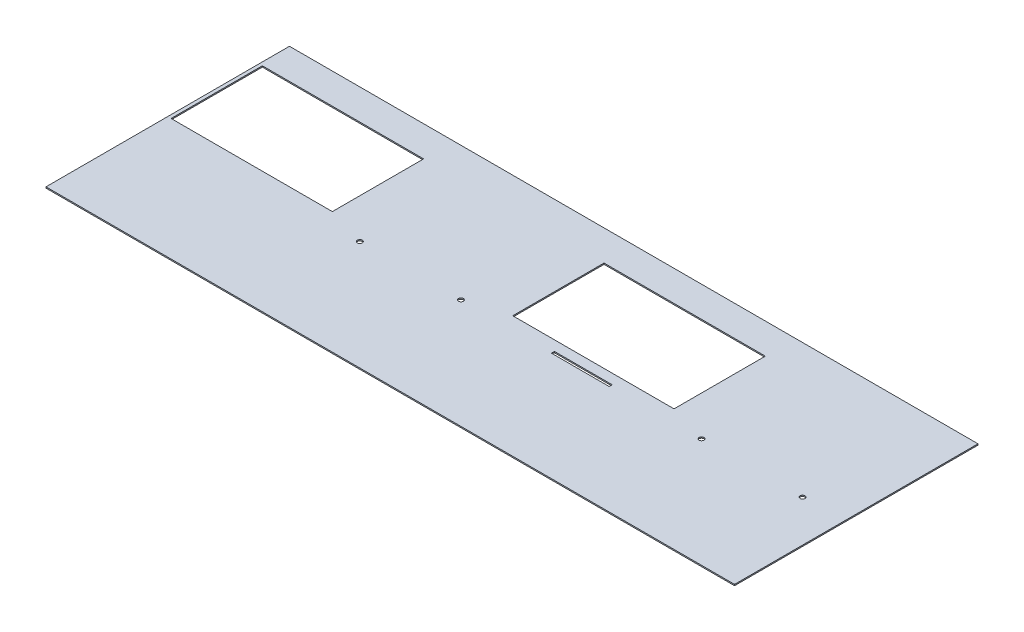
ISO-10303-21;
HEADER;
FILE_DESCRIPTION(('STEP AP214'),'2;1');
FILE_NAME('part.step','',(''),(''),'','','');
FILE_SCHEMA(('AUTOMOTIVE_DESIGN { 1 0 10303 214 1 1 1 1 }'));
ENDSEC;
DATA;
#1=APPLICATION_CONTEXT('core data for automotive mechanical design processes');
#2=APPLICATION_PROTOCOL_DEFINITION('international standard','automotive_design',2000,#1);
#3=PRODUCT_CONTEXT('',#1,'mechanical');
#4=PRODUCT('Part','Part','',(#3));
#5=PRODUCT_RELATED_PRODUCT_CATEGORY('part','',(#4));
#6=PRODUCT_DEFINITION_FORMATION('','',#4);
#7=PRODUCT_DEFINITION_CONTEXT('part definition',#1,'design');
#8=PRODUCT_DEFINITION('design','',#6,#7);
#9=PRODUCT_DEFINITION_SHAPE('','',#8);
#10=(LENGTH_UNIT() NAMED_UNIT(*) SI_UNIT(.MILLI.,.METRE.));
#11=(NAMED_UNIT(*) PLANE_ANGLE_UNIT() SI_UNIT($,.RADIAN.));
#12=(NAMED_UNIT(*) SI_UNIT($,.STERADIAN.) SOLID_ANGLE_UNIT());
#13=UNCERTAINTY_MEASURE_WITH_UNIT(LENGTH_MEASURE(1.E-05),#10,'distance_accuracy_value','');
#14=(GEOMETRIC_REPRESENTATION_CONTEXT(3) GLOBAL_UNCERTAINTY_ASSIGNED_CONTEXT((#13)) GLOBAL_UNIT_ASSIGNED_CONTEXT((#10,
#11,#12)) REPRESENTATION_CONTEXT('',''));
#15=CARTESIAN_POINT('',(0.,0.,0.));
#16=DIRECTION('',(0.,0.,1.));
#17=DIRECTION('',(1.,0.,0.));
#18=AXIS2_PLACEMENT_3D('',#15,#16,#17);
#19=CARTESIAN_POINT('',(142.,2.,200.));
#20=DIRECTION('',(0.,0.,-1.));
#21=DIRECTION('',(-1.,0.,0.));
#22=AXIS2_PLACEMENT_3D('',#19,#20,#21);
#23=PLANE('',#22);
#24=DIRECTION('',(1.,0.,0.));
#25=VECTOR('',#24,1.);
#26=CARTESIAN_POINT('',(142.,0.,200.));
#27=LINE('',#26,#25);
#28=CARTESIAN_POINT('',(-699.424777960769,-5.80091530366644E-12,200.));
#29=VERTEX_POINT('',#28);
#30=CARTESIAN_POINT('',(431.924777960769,-2.19269047363468E-12,200.));
#31=VERTEX_POINT('',#30);
#32=EDGE_CURVE('E258',#29,#31,#27,.T.);
#33=ORIENTED_EDGE('',*,*,#32,.T.);
#34=DIRECTION('',(0.,1.,0.));
#35=VECTOR('',#34,1.);
#36=CARTESIAN_POINT('',(431.924777960769,-2.13717932240343E-12,200.));
#37=LINE('',#36,#35);
#38=CARTESIAN_POINT('',(431.924777960769,1.99999999999781,200.));
#39=VERTEX_POINT('',#38);
#40=EDGE_CURVE('E344',#31,#39,#37,.T.);
#41=ORIENTED_EDGE('',*,*,#40,.T.);
#42=DIRECTION('',(1.,0.,0.));
#43=VECTOR('',#42,1.);
#44=CARTESIAN_POINT('',(142.,2.,200.));
#45=LINE('',#44,#43);
#46=CARTESIAN_POINT('',(-699.424777960769,1.9999999999942,200.));
#47=VERTEX_POINT('',#46);
#48=EDGE_CURVE('E141',#47,#39,#45,.T.);
#49=ORIENTED_EDGE('',*,*,#48,.F.);
#50=DIRECTION('',(0.,1.,0.));
#51=VECTOR('',#50,1.);
#52=CARTESIAN_POINT('',(-699.424777960769,-5.80091530366644E-12,200.));
#53=LINE('',#52,#51);
#54=EDGE_CURVE('E322',#29,#47,#53,.T.);
#55=ORIENTED_EDGE('',*,*,#54,.F.);
#56=EDGE_LOOP('',(#33,#41,#49,#55));
#57=FACE_BOUND('',#56,.T.);
#58=ADVANCED_FACE('F131',(#57),#23,.F.);
#59=CARTESIAN_POINT('',(142.,2.,-200.));
#60=DIRECTION('',(0.,0.,1.));
#61=DIRECTION('',(1.,0.,0.));
#62=AXIS2_PLACEMENT_3D('',#59,#60,#61);
#63=PLANE('',#62);
#64=DIRECTION('',(-1.,0.,0.));
#65=VECTOR('',#64,1.);
#66=CARTESIAN_POINT('',(142.,2.,-200.));
#67=LINE('',#66,#65);
#68=CARTESIAN_POINT('',(431.924777960769,1.99999999999781,-200.));
#69=VERTEX_POINT('',#68);
#70=CARTESIAN_POINT('',(-699.424777960769,1.9999999999942,-200.));
#71=VERTEX_POINT('',#70);
#72=EDGE_CURVE('E13',#69,#71,#67,.T.);
#73=ORIENTED_EDGE('',*,*,#72,.F.);
#74=DIRECTION('',(0.,1.,0.));
#75=VECTOR('',#74,1.);
#76=CARTESIAN_POINT('',(431.924777960769,-2.13717932240343E-12,-200.));
#77=LINE('',#76,#75);
#78=CARTESIAN_POINT('',(431.924777960769,-2.19269047363468E-12,-200.));
#79=VERTEX_POINT('',#78);
#80=EDGE_CURVE('E253',#79,#69,#77,.T.);
#81=ORIENTED_EDGE('',*,*,#80,.F.);
#82=DIRECTION('',(-1.,0.,0.));
#83=VECTOR('',#82,1.);
#84=CARTESIAN_POINT('',(142.,0.,-200.));
#85=LINE('',#84,#83);
#86=CARTESIAN_POINT('',(-699.424777960769,-5.80091530366644E-12,-200.));
#87=VERTEX_POINT('',#86);
#88=EDGE_CURVE('E247',#79,#87,#85,.T.);
#89=ORIENTED_EDGE('',*,*,#88,.T.);
#90=DIRECTION('',(0.,1.,0.));
#91=VECTOR('',#90,1.);
#92=CARTESIAN_POINT('',(-699.424777960769,-5.80091530366644E-12,-200.));
#93=LINE('',#92,#91);
#94=EDGE_CURVE('E251',#87,#71,#93,.T.);
#95=ORIENTED_EDGE('',*,*,#94,.T.);
#96=EDGE_LOOP('',(#73,#81,#89,#95));
#97=FACE_BOUND('',#96,.T.);
#98=ADVANCED_FACE('F249',(#97),#63,.F.);
#99=CARTESIAN_POINT('',(0.,2.,0.));
#100=DIRECTION('',(0.,1.,0.));
#101=DIRECTION('',(0.,0.,1.));
#102=AXIS2_PLACEMENT_3D('',#99,#100,#101);
#103=PLANE('',#102);
#104=DIRECTION('',(1.,0.,0.));
#105=VECTOR('',#104,1.);
#106=CARTESIAN_POINT('',(-47.5,2.,16.4999999999999));
#107=LINE('',#106,#105);
#108=CARTESIAN_POINT('',(-47.5,2.,16.4999999999999));
#109=VERTEX_POINT('',#108);
#110=CARTESIAN_POINT('',(47.5,2.,16.4999999999999));
#111=VERTEX_POINT('',#110);
#112=EDGE_CURVE('E360',#109,#111,#107,.T.);
#113=ORIENTED_EDGE('',*,*,#112,.T.);
#114=DIRECTION('',(0.,0.,1.));
#115=VECTOR('',#114,1.);
#116=CARTESIAN_POINT('',(47.5,2.,21.4999999999999));
#117=LINE('',#116,#115);
#118=CARTESIAN_POINT('',(47.5,2.,21.4999999999999));
#119=VERTEX_POINT('',#118);
#120=EDGE_CURVE('E385',#111,#119,#117,.T.);
#121=ORIENTED_EDGE('',*,*,#120,.T.);
#122=DIRECTION('',(-1.,0.,0.));
#123=VECTOR('',#122,1.);
#124=CARTESIAN_POINT('',(-47.5,2.,21.4999999999999));
#125=LINE('',#124,#123);
#126=CARTESIAN_POINT('',(-47.5,2.,21.4999999999999));
#127=VERTEX_POINT('',#126);
#128=EDGE_CURVE('E380',#119,#127,#125,.T.);
#129=ORIENTED_EDGE('',*,*,#128,.T.);
#130=DIRECTION('',(0.,0.,-1.));
#131=VECTOR('',#130,1.);
#132=CARTESIAN_POINT('',(-47.5,2.,21.4999999999999));
#133=LINE('',#132,#131);
#134=EDGE_CURVE('E375',#127,#109,#133,.T.);
#135=ORIENTED_EDGE('',*,*,#134,.T.);
#136=EDGE_LOOP('',(#113,#121,#129,#135));
#137=FACE_BOUND('',#136,.T.);
#138=DIRECTION('',(0.,0.,1.));
#139=VECTOR('',#138,1.);
#140=CARTESIAN_POINT('',(-132.5,2.,0.));
#141=LINE('',#140,#139);
#142=CARTESIAN_POINT('',(-132.5,2.,-150.));
#143=VERTEX_POINT('',#142);
#144=CARTESIAN_POINT('',(-132.5,2.,0.));
#145=VERTEX_POINT('',#144);
#146=EDGE_CURVE('E423',#143,#145,#141,.T.);
#147=ORIENTED_EDGE('',*,*,#146,.F.);
#148=DIRECTION('',(-1.,0.,0.));
#149=VECTOR('',#148,1.);
#150=CARTESIAN_POINT('',(0.,2.,-150.));
#151=LINE('',#150,#149);
#152=CARTESIAN_POINT('',(132.5,2.,-150.));
#153=VERTEX_POINT('',#152);
#154=EDGE_CURVE('E412',#153,#143,#151,.T.);
#155=ORIENTED_EDGE('',*,*,#154,.F.);
#156=DIRECTION('',(0.,0.,-1.));
#157=VECTOR('',#156,1.);
#158=CARTESIAN_POINT('',(132.5,2.,0.));
#159=LINE('',#158,#157);
#160=CARTESIAN_POINT('',(132.5,2.,0.));
#161=VERTEX_POINT('',#160);
#162=EDGE_CURVE('E415',#161,#153,#159,.T.);
#163=ORIENTED_EDGE('',*,*,#162,.F.);
#164=DIRECTION('',(1.,0.,0.));
#165=VECTOR('',#164,1.);
#166=CARTESIAN_POINT('',(0.,2.,0.));
#167=LINE('',#166,#165);
#168=EDGE_CURVE('E420',#145,#161,#167,.T.);
#169=ORIENTED_EDGE('',*,*,#168,.F.);
#170=EDGE_LOOP('',(#147,#155,#163,#169));
#171=FACE_BOUND('',#170,.T.);
#172=ORIENTED_EDGE('',*,*,#48,.T.);
#173=DIRECTION('',(0.,0.,-1.));
#174=VECTOR('',#173,1.);
#175=CARTESIAN_POINT('',(431.924777960769,1.99999999999781,200.));
#176=LINE('',#175,#174);
#177=EDGE_CURVE('E353',#69,#39,#176,.F.);
#178=ORIENTED_EDGE('',*,*,#177,.F.);
#179=ORIENTED_EDGE('',*,*,#72,.T.);
#180=DIRECTION('',(0.,0.,1.));
#181=VECTOR('',#180,1.);
#182=CARTESIAN_POINT('',(-699.424777960769,1.9999999999942,-200.));
#183=LINE('',#182,#181);
#184=EDGE_CURVE('E272',#47,#71,#183,.F.);
#185=ORIENTED_EDGE('',*,*,#184,.F.);
#186=EDGE_LOOP('',(#172,#178,#179,#185));
#187=FACE_BOUND('',#186,.T.);
#188=CARTESIAN_POINT('',(197.712388980385,1.99999999999964,19.9999999999999));
#189=DIRECTION('',(0.,-1.,0.));
#190=DIRECTION('',(1.,0.,0.));
#191=AXIS2_PLACEMENT_3D('',#188,#189,#190);
#192=CIRCLE('',#191,4.00000000000001);
#193=CARTESIAN_POINT('',(201.712388980385,1.99999999999956,19.9999999999999));
#194=VERTEX_POINT('',#193);
#195=EDGE_CURVE('E332',#194,#194,#192,.T.);
#196=ORIENTED_EDGE('',*,*,#195,.T.);
#197=EDGE_LOOP('',(#196));
#198=FACE_BOUND('',#197,.T.);
#199=CARTESIAN_POINT('',(363.712388980385,1.99999999999848,20.));
#200=DIRECTION('',(0.,-1.,0.));
#201=DIRECTION('',(1.,0.,0.));
#202=AXIS2_PLACEMENT_3D('',#199,#200,#201);
#203=CIRCLE('',#202,4.00000000000001);
#204=CARTESIAN_POINT('',(367.712388980385,1.99999999999845,20.));
#205=VERTEX_POINT('',#204);
#206=EDGE_CURVE('E327',#205,#205,#203,.T.);
#207=ORIENTED_EDGE('',*,*,#206,.T.);
#208=EDGE_LOOP('',(#207));
#209=FACE_BOUND('',#208,.T.);
#210=DIRECTION('',(0.,0.,-1.));
#211=VECTOR('',#210,1.);
#212=CARTESIAN_POINT('',(-428.92477796077,1.99999999999798,0.));
#213=LINE('',#212,#211);
#214=CARTESIAN_POINT('',(-428.92477796077,1.99999999999703,0.));
#215=VERTEX_POINT('',#214);
#216=CARTESIAN_POINT('',(-428.92477796077,1.99999999999798,-150.));
#217=VERTEX_POINT('',#216);
#218=EDGE_CURVE('E288',#215,#217,#213,.T.);
#219=ORIENTED_EDGE('',*,*,#218,.F.);
#220=DIRECTION('',(1.,0.,0.));
#221=VECTOR('',#220,1.);
#222=CARTESIAN_POINT('',(-561.424777960768,1.99999999999614,0.));
#223=LINE('',#222,#221);
#224=CARTESIAN_POINT('',(-693.92477796077,1.99999999999428,0.));
#225=VERTEX_POINT('',#224);
#226=EDGE_CURVE('E299',#225,#215,#223,.T.);
#227=ORIENTED_EDGE('',*,*,#226,.F.);
#228=DIRECTION('',(0.,0.,1.));
#229=VECTOR('',#228,1.);
#230=CARTESIAN_POINT('',(-693.92477796077,1.99999999999428,0.));
#231=LINE('',#230,#229);
#232=CARTESIAN_POINT('',(-693.92477796077,1.99999999999523,-150.));
#233=VERTEX_POINT('',#232);
#234=EDGE_CURVE('E310',#233,#225,#231,.T.);
#235=ORIENTED_EDGE('',*,*,#234,.F.);
#236=DIRECTION('',(-1.,0.,0.));
#237=VECTOR('',#236,1.);
#238=CARTESIAN_POINT('',(-561.424777960768,1.99999999999614,-150.));
#239=LINE('',#238,#237);
#240=EDGE_CURVE('E319',#217,#233,#239,.T.);
#241=ORIENTED_EDGE('',*,*,#240,.F.);
#242=EDGE_LOOP('',(#219,#227,#235,#241));
#243=FACE_BOUND('',#242,.T.);
#244=CARTESIAN_POINT('',(-197.712388980386,1.99999999999964,19.9999999999999));
#245=DIRECTION('',(0.,-1.,0.));
#246=DIRECTION('',(1.,0.,0.));
#247=AXIS2_PLACEMENT_3D('',#244,#245,#246);
#248=CIRCLE('',#247,4.00000000000001);
#249=CARTESIAN_POINT('',(-201.712388980386,1.99999999999961,19.9999999999999));
#250=VERTEX_POINT('',#249);
#251=EDGE_CURVE('E274',#250,#250,#248,.T.);
#252=ORIENTED_EDGE('',*,*,#251,.T.);
#253=EDGE_LOOP('',(#252));
#254=FACE_BOUND('',#253,.T.);
#255=CARTESIAN_POINT('',(-363.712388980386,1.99999999999848,20.));
#256=DIRECTION('',(0.,-1.,0.));
#257=DIRECTION('',(1.,0.,0.));
#258=AXIS2_PLACEMENT_3D('',#255,#256,#257);
#259=CIRCLE('',#258,4.00000000000001);
#260=CARTESIAN_POINT('',(-367.712388980386,1.99999999999845,20.));
#261=VERTEX_POINT('',#260);
#262=EDGE_CURVE('E278',#261,#261,#259,.T.);
#263=ORIENTED_EDGE('',*,*,#262,.T.);
#264=EDGE_LOOP('',(#263));
#265=FACE_BOUND('',#264,.T.);
#266=ADVANCED_FACE('F456',(#137,#171,#187,#198,#209,#243,#254,#265),#103,.T.);
#267=CARTESIAN_POINT('',(0.,0.,0.));
#268=DIRECTION('',(0.,1.,0.));
#269=DIRECTION('',(0.,0.,1.));
#270=AXIS2_PLACEMENT_3D('',#267,#268,#269);
#271=PLANE('',#270);
#272=DIRECTION('',(0.,0.,1.));
#273=VECTOR('',#272,1.);
#274=CARTESIAN_POINT('',(47.5,0.,21.4999999999999));
#275=LINE('',#274,#273);
#276=CARTESIAN_POINT('',(47.5,0.,16.4999999999999));
#277=VERTEX_POINT('',#276);
#278=CARTESIAN_POINT('',(47.5,0.,21.4999999999999));
#279=VERTEX_POINT('',#278);
#280=EDGE_CURVE('E361',#277,#279,#275,.T.);
#281=ORIENTED_EDGE('',*,*,#280,.F.);
#282=DIRECTION('',(1.,0.,0.));
#283=VECTOR('',#282,1.);
#284=CARTESIAN_POINT('',(-47.5,0.,16.4999999999999));
#285=LINE('',#284,#283);
#286=CARTESIAN_POINT('',(-47.5,0.,16.4999999999999));
#287=VERTEX_POINT('',#286);
#288=EDGE_CURVE('E365',#287,#277,#285,.T.);
#289=ORIENTED_EDGE('',*,*,#288,.F.);
#290=DIRECTION('',(0.,0.,-1.));
#291=VECTOR('',#290,1.);
#292=CARTESIAN_POINT('',(-47.5,0.,21.4999999999999));
#293=LINE('',#292,#291);
#294=CARTESIAN_POINT('',(-47.5,0.,21.4999999999999));
#295=VERTEX_POINT('',#294);
#296=EDGE_CURVE('E331',#295,#287,#293,.T.);
#297=ORIENTED_EDGE('',*,*,#296,.F.);
#298=DIRECTION('',(-1.,0.,0.));
#299=VECTOR('',#298,1.);
#300=CARTESIAN_POINT('',(-47.5,0.,21.4999999999999));
#301=LINE('',#300,#299);
#302=EDGE_CURVE('E157',#279,#295,#301,.T.);
#303=ORIENTED_EDGE('',*,*,#302,.F.);
#304=EDGE_LOOP('',(#281,#289,#297,#303));
#305=FACE_BOUND('',#304,.T.);
#306=DIRECTION('',(1.,0.,0.));
#307=VECTOR('',#306,1.);
#308=CARTESIAN_POINT('',(-132.5,0.,-150.));
#309=LINE('',#308,#307);
#310=CARTESIAN_POINT('',(-132.5,0.,-150.));
#311=VERTEX_POINT('',#310);
#312=CARTESIAN_POINT('',(132.5,0.,-150.));
#313=VERTEX_POINT('',#312);
#314=EDGE_CURVE('E400',#311,#313,#309,.T.);
#315=ORIENTED_EDGE('',*,*,#314,.F.);
#316=DIRECTION('',(0.,0.,-1.));
#317=VECTOR('',#316,1.);
#318=CARTESIAN_POINT('',(-132.5,0.,0.));
#319=LINE('',#318,#317);
#320=CARTESIAN_POINT('',(-132.5,0.,0.));
#321=VERTEX_POINT('',#320);
#322=EDGE_CURVE('E397',#321,#311,#319,.T.);
#323=ORIENTED_EDGE('',*,*,#322,.F.);
#324=DIRECTION('',(-1.,0.,0.));
#325=VECTOR('',#324,1.);
#326=CARTESIAN_POINT('',(-132.5,0.,0.));
#327=LINE('',#326,#325);
#328=CARTESIAN_POINT('',(132.5,0.,0.));
#329=VERTEX_POINT('',#328);
#330=EDGE_CURVE('E408',#329,#321,#327,.T.);
#331=ORIENTED_EDGE('',*,*,#330,.F.);
#332=DIRECTION('',(0.,0.,1.));
#333=VECTOR('',#332,1.);
#334=CARTESIAN_POINT('',(132.5,0.,0.));
#335=LINE('',#334,#333);
#336=EDGE_CURVE('E404',#313,#329,#335,.T.);
#337=ORIENTED_EDGE('',*,*,#336,.F.);
#338=EDGE_LOOP('',(#315,#323,#331,#337));
#339=FACE_BOUND('',#338,.T.);
#340=ORIENTED_EDGE('',*,*,#88,.F.);
#341=DIRECTION('',(0.,0.,1.));
#342=VECTOR('',#341,1.);
#343=CARTESIAN_POINT('',(431.924777960769,-2.19269047363468E-12,0.));
#344=LINE('',#343,#342);
#345=EDGE_CURVE('E348',#79,#31,#344,.T.);
#346=ORIENTED_EDGE('',*,*,#345,.T.);
#347=ORIENTED_EDGE('',*,*,#32,.F.);
#348=DIRECTION('',(0.,0.,-1.));
#349=VECTOR('',#348,1.);
#350=CARTESIAN_POINT('',(-699.424777960769,-5.80091530366644E-12,0.));
#351=LINE('',#350,#349);
#352=EDGE_CURVE('E261',#29,#87,#351,.T.);
#353=ORIENTED_EDGE('',*,*,#352,.T.);
#354=EDGE_LOOP('',(#340,#346,#347,#353));
#355=FACE_BOUND('',#354,.T.);
#356=CARTESIAN_POINT('',(197.712388980385,-3.60822483003176E-13,19.9999999999999));
#357=DIRECTION('',(0.,-1.,0.));
#358=DIRECTION('',(1.,0.,0.));
#359=AXIS2_PLACEMENT_3D('',#356,#357,#358);
#360=CIRCLE('',#359,4.00000000000001);
#361=CARTESIAN_POINT('',(201.712388980385,-4.44089209850063E-13,19.9999999999999));
#362=VERTEX_POINT('',#361);
#363=EDGE_CURVE('E336',#362,#362,#360,.T.);
#364=ORIENTED_EDGE('',*,*,#363,.F.);
#365=EDGE_LOOP('',(#364));
#366=FACE_BOUND('',#365,.T.);
#367=CARTESIAN_POINT('',(363.712388980385,-1.52655665885959E-12,20.));
#368=DIRECTION('',(0.,-1.,0.));
#369=DIRECTION('',(1.,0.,0.));
#370=AXIS2_PLACEMENT_3D('',#367,#368,#369);
#371=CIRCLE('',#370,4.00000000000001);
#372=CARTESIAN_POINT('',(367.712388980385,-1.55431223447522E-12,20.));
#373=VERTEX_POINT('',#372);
#374=EDGE_CURVE('E340',#373,#373,#371,.T.);
#375=ORIENTED_EDGE('',*,*,#374,.F.);
#376=EDGE_LOOP('',(#375));
#377=FACE_BOUND('',#376,.T.);
#378=CARTESIAN_POINT('',(-197.712388980386,-3.60822483003176E-13,19.9999999999999));
#379=DIRECTION('',(0.,-1.,0.));
#380=DIRECTION('',(1.,0.,0.));
#381=AXIS2_PLACEMENT_3D('',#378,#379,#380);
#382=CIRCLE('',#381,4.00000000000001);
#383=CARTESIAN_POINT('',(-201.712388980386,-3.86843335142828E-13,19.9999999999999));
#384=VERTEX_POINT('',#383);
#385=EDGE_CURVE('E841',#384,#384,#382,.F.);
#386=ORIENTED_EDGE('',*,*,#385,.T.);
#387=EDGE_LOOP('',(#386));
#388=FACE_BOUND('',#387,.T.);
#389=CARTESIAN_POINT('',(-363.712388980386,-1.52655665885959E-12,20.));
#390=DIRECTION('',(0.,-1.,0.));
#391=DIRECTION('',(1.,0.,0.));
#392=AXIS2_PLACEMENT_3D('',#389,#390,#391);
#393=CIRCLE('',#392,4.00000000000001);
#394=CARTESIAN_POINT('',(-367.712388980386,-1.55257751099924E-12,20.));
#395=VERTEX_POINT('',#394);
#396=EDGE_CURVE('E357',#395,#395,#393,.F.);
#397=ORIENTED_EDGE('',*,*,#396,.T.);
#398=EDGE_LOOP('',(#397));
#399=FACE_BOUND('',#398,.T.);
#400=DIRECTION('',(-1.,0.,0.));
#401=VECTOR('',#400,1.);
#402=CARTESIAN_POINT('',(-428.924777960772,-2.02615701994091E-12,0.));
#403=LINE('',#402,#401);
#404=CARTESIAN_POINT('',(-428.92477796077,-2.02615701994091E-12,0.));
#405=VERTEX_POINT('',#404);
#406=CARTESIAN_POINT('',(-693.92477796077,-5.71764857681956E-12,0.));
#407=VERTEX_POINT('',#406);
#408=EDGE_CURVE('E296',#405,#407,#403,.T.);
#409=ORIENTED_EDGE('',*,*,#408,.F.);
#410=DIRECTION('',(0.,0.,1.));
#411=VECTOR('',#410,1.);
#412=CARTESIAN_POINT('',(-428.92477796077,-2.02615701994091E-12,0.));
#413=LINE('',#412,#411);
#414=CARTESIAN_POINT('',(-428.92477796077,-2.02615701994091E-12,-150.));
#415=VERTEX_POINT('',#414);
#416=EDGE_CURVE('E285',#415,#405,#413,.T.);
#417=ORIENTED_EDGE('',*,*,#416,.F.);
#418=DIRECTION('',(1.,0.,0.));
#419=VECTOR('',#418,1.);
#420=CARTESIAN_POINT('',(-428.924777960772,-2.02615701994091E-12,-150.));
#421=LINE('',#420,#419);
#422=CARTESIAN_POINT('',(-693.92477796077,-5.71764857681956E-12,-150.));
#423=VERTEX_POINT('',#422);
#424=EDGE_CURVE('E316',#423,#415,#421,.T.);
#425=ORIENTED_EDGE('',*,*,#424,.F.);
#426=DIRECTION('',(0.,0.,-1.));
#427=VECTOR('',#426,1.);
#428=CARTESIAN_POINT('',(-693.92477796077,-5.71764857681956E-12,0.));
#429=LINE('',#428,#427);
#430=EDGE_CURVE('E306',#407,#423,#429,.T.);
#431=ORIENTED_EDGE('',*,*,#430,.F.);
#432=EDGE_LOOP('',(#409,#417,#425,#431));
#433=FACE_BOUND('',#432,.T.);
#434=ADVANCED_FACE('F133',(#305,#339,#355,#366,#377,#388,#399,#433),#271,.F.);
#435=CARTESIAN_POINT('',(-132.5,588.507799571703,0.));
#436=DIRECTION('',(-1.,0.,0.));
#437=DIRECTION('',(0.,0.,1.));
#438=AXIS2_PLACEMENT_3D('',#435,#436,#437);
#439=PLANE('',#438);
#440=ORIENTED_EDGE('',*,*,#146,.T.);
#441=DIRECTION('',(0.,-1.,0.));
#442=VECTOR('',#441,1.);
#443=CARTESIAN_POINT('',(-132.5,588.507799571703,0.));
#444=LINE('',#443,#442);
#445=EDGE_CURVE('E416',#145,#321,#444,.T.);
#446=ORIENTED_EDGE('',*,*,#445,.T.);
#447=ORIENTED_EDGE('',*,*,#322,.T.);
#448=DIRECTION('',(0.,-1.,0.));
#449=VECTOR('',#448,1.);
#450=CARTESIAN_POINT('',(-132.5,588.507799571703,-150.));
#451=LINE('',#450,#449);
#452=EDGE_CURVE('E135',#143,#311,#451,.T.);
#453=ORIENTED_EDGE('',*,*,#452,.F.);
#454=EDGE_LOOP('',(#440,#446,#447,#453));
#455=FACE_BOUND('',#454,.T.);
#456=ADVANCED_FACE('F459',(#455),#439,.F.);
#457=CARTESIAN_POINT('',(-132.5,588.507799571703,0.));
#458=DIRECTION('',(0.,0.,1.));
#459=DIRECTION('',(1.,0.,0.));
#460=AXIS2_PLACEMENT_3D('',#457,#458,#459);
#461=PLANE('',#460);
#462=ORIENTED_EDGE('',*,*,#168,.T.);
#463=DIRECTION('',(0.,-1.,0.));
#464=VECTOR('',#463,1.);
#465=CARTESIAN_POINT('',(132.5,588.507799571703,0.));
#466=LINE('',#465,#464);
#467=EDGE_CURVE('E432',#161,#329,#466,.T.);
#468=ORIENTED_EDGE('',*,*,#467,.T.);
#469=ORIENTED_EDGE('',*,*,#330,.T.);
#470=ORIENTED_EDGE('',*,*,#445,.F.);
#471=EDGE_LOOP('',(#462,#468,#469,#470));
#472=FACE_BOUND('',#471,.T.);
#473=ADVANCED_FACE('F460',(#472),#461,.F.);
#474=CARTESIAN_POINT('',(132.5,588.507799571703,0.));
#475=DIRECTION('',(1.,0.,0.));
#476=DIRECTION('',(0.,0.,-1.));
#477=AXIS2_PLACEMENT_3D('',#474,#475,#476);
#478=PLANE('',#477);
#479=ORIENTED_EDGE('',*,*,#162,.T.);
#480=DIRECTION('',(0.,-1.,0.));
#481=VECTOR('',#480,1.);
#482=CARTESIAN_POINT('',(132.5,588.507799571703,-150.));
#483=LINE('',#482,#481);
#484=EDGE_CURVE('E434',#153,#313,#483,.T.);
#485=ORIENTED_EDGE('',*,*,#484,.T.);
#486=ORIENTED_EDGE('',*,*,#336,.T.);
#487=ORIENTED_EDGE('',*,*,#467,.F.);
#488=EDGE_LOOP('',(#479,#485,#486,#487));
#489=FACE_BOUND('',#488,.T.);
#490=ADVANCED_FACE('F451',(#489),#478,.F.);
#491=CARTESIAN_POINT('',(-132.5,588.507799571703,-150.));
#492=DIRECTION('',(0.,0.,-1.));
#493=DIRECTION('',(-1.,0.,0.));
#494=AXIS2_PLACEMENT_3D('',#491,#492,#493);
#495=PLANE('',#494);
#496=ORIENTED_EDGE('',*,*,#154,.T.);
#497=ORIENTED_EDGE('',*,*,#452,.T.);
#498=ORIENTED_EDGE('',*,*,#314,.T.);
#499=ORIENTED_EDGE('',*,*,#484,.F.);
#500=EDGE_LOOP('',(#496,#497,#498,#499));
#501=FACE_BOUND('',#500,.T.);
#502=ADVANCED_FACE('F442',(#501),#495,.F.);
#503=CARTESIAN_POINT('',(-47.5,97.1314879522022,16.4999999999999));
#504=DIRECTION('',(0.,0.,-1.));
#505=DIRECTION('',(-1.,0.,0.));
#506=AXIS2_PLACEMENT_3D('',#503,#504,#505);
#507=PLANE('',#506);
#508=DIRECTION('',(0.,-1.,0.));
#509=VECTOR('',#508,1.);
#510=CARTESIAN_POINT('',(-47.5,97.1314879522022,16.4999999999999));
#511=LINE('',#510,#509);
#512=EDGE_CURVE('E149',#109,#287,#511,.T.);
#513=ORIENTED_EDGE('',*,*,#512,.T.);
#514=ORIENTED_EDGE('',*,*,#288,.T.);
#515=DIRECTION('',(0.,-1.,0.));
#516=VECTOR('',#515,1.);
#517=CARTESIAN_POINT('',(47.5,97.1314879522022,16.4999999999999));
#518=LINE('',#517,#516);
#519=EDGE_CURVE('E374',#111,#277,#518,.T.);
#520=ORIENTED_EDGE('',*,*,#519,.F.);
#521=ORIENTED_EDGE('',*,*,#112,.F.);
#522=EDGE_LOOP('',(#513,#514,#520,#521));
#523=FACE_BOUND('',#522,.T.);
#524=ADVANCED_FACE('F479',(#523),#507,.F.);
#525=CARTESIAN_POINT('',(47.5,97.1314879522022,21.4999999999999));
#526=DIRECTION('',(1.,0.,0.));
#527=DIRECTION('',(0.,0.,-1.));
#528=AXIS2_PLACEMENT_3D('',#525,#526,#527);
#529=PLANE('',#528);
#530=ORIENTED_EDGE('',*,*,#519,.T.);
#531=ORIENTED_EDGE('',*,*,#280,.T.);
#532=DIRECTION('',(0.,-1.,0.));
#533=VECTOR('',#532,1.);
#534=CARTESIAN_POINT('',(47.5,97.1314879522022,21.4999999999999));
#535=LINE('',#534,#533);
#536=EDGE_CURVE('E384',#119,#279,#535,.T.);
#537=ORIENTED_EDGE('',*,*,#536,.F.);
#538=ORIENTED_EDGE('',*,*,#120,.F.);
#539=EDGE_LOOP('',(#530,#531,#537,#538));
#540=FACE_BOUND('',#539,.T.);
#541=ADVANCED_FACE('F483',(#540),#529,.F.);
#542=CARTESIAN_POINT('',(-47.5,97.1314879522022,21.4999999999999));
#543=DIRECTION('',(0.,0.,1.));
#544=DIRECTION('',(1.,0.,0.));
#545=AXIS2_PLACEMENT_3D('',#542,#543,#544);
#546=PLANE('',#545);
#547=ORIENTED_EDGE('',*,*,#536,.T.);
#548=ORIENTED_EDGE('',*,*,#302,.T.);
#549=DIRECTION('',(0.,-1.,0.));
#550=VECTOR('',#549,1.);
#551=CARTESIAN_POINT('',(-47.5,97.1314879522022,21.4999999999999));
#552=LINE('',#551,#550);
#553=EDGE_CURVE('E379',#127,#295,#552,.T.);
#554=ORIENTED_EDGE('',*,*,#553,.F.);
#555=ORIENTED_EDGE('',*,*,#128,.F.);
#556=EDGE_LOOP('',(#547,#548,#554,#555));
#557=FACE_BOUND('',#556,.T.);
#558=ADVANCED_FACE('F489',(#557),#546,.F.);
#559=CARTESIAN_POINT('',(-47.5,97.1314879522022,21.4999999999999));
#560=DIRECTION('',(-1.,0.,0.));
#561=DIRECTION('',(0.,0.,1.));
#562=AXIS2_PLACEMENT_3D('',#559,#560,#561);
#563=PLANE('',#562);
#564=ORIENTED_EDGE('',*,*,#553,.T.);
#565=ORIENTED_EDGE('',*,*,#296,.T.);
#566=ORIENTED_EDGE('',*,*,#512,.F.);
#567=ORIENTED_EDGE('',*,*,#134,.F.);
#568=EDGE_LOOP('',(#564,#565,#566,#567));
#569=FACE_BOUND('',#568,.T.);
#570=ADVANCED_FACE('F504',(#569),#563,.F.);
#571=CARTESIAN_POINT('',(431.924777960769,-2.13717932240343E-12,200.));
#572=DIRECTION('',(-1.,0.,0.));
#573=DIRECTION('',(0.,-1.,0.));
#574=AXIS2_PLACEMENT_3D('',#571,#572,#573);
#575=PLANE('',#574);
#576=ORIENTED_EDGE('',*,*,#177,.T.);
#577=ORIENTED_EDGE('',*,*,#40,.F.);
#578=ORIENTED_EDGE('',*,*,#345,.F.);
#579=ORIENTED_EDGE('',*,*,#80,.T.);
#580=EDGE_LOOP('',(#576,#577,#578,#579));
#581=FACE_BOUND('',#580,.T.);
#582=ADVANCED_FACE('F506',(#581),#575,.F.);
#583=CARTESIAN_POINT('',(363.712388980387,295.313708498985,20.));
#584=DIRECTION('',(0.,-1.,0.));
#585=DIRECTION('',(1.,0.,0.));
#586=AXIS2_PLACEMENT_3D('',#583,#584,#585);
#587=CYLINDRICAL_SURFACE('',#586,4.00000000000001);
#588=CARTESIAN_POINT('',(367.712388980385,-1.55431223447522E-12,20.));
#589=CARTESIAN_POINT('',(367.712388980385,0.020833333331786,20.));
#590=CARTESIAN_POINT('',(367.712388980385,0.0416666666651263,20.));
#591=CARTESIAN_POINT('',(367.712388980385,0.0833333333317883,20.));
#592=CARTESIAN_POINT('',(367.712388980385,0.10416666666511,20.));
#593=CARTESIAN_POINT('',(367.712388980385,0.145833333331772,20.));
#594=CARTESIAN_POINT('',(367.712388980385,0.166666666665113,20.));
#595=CARTESIAN_POINT('',(367.712388980385,0.208333333331775,20.));
#596=CARTESIAN_POINT('',(367.712388980385,0.229166666665096,20.));
#597=CARTESIAN_POINT('',(367.712388980385,0.270833333331758,20.));
#598=CARTESIAN_POINT('',(367.712388980385,0.291666666665099,20.));
#599=CARTESIAN_POINT('',(367.712388980385,0.333333333331779,20.));
#600=CARTESIAN_POINT('',(367.712388980385,0.35416666666512,20.));
#601=CARTESIAN_POINT('',(367.712388980385,0.395833333331782,20.));
#602=CARTESIAN_POINT('',(367.712388980385,0.416666666665103,20.));
#603=CARTESIAN_POINT('',(367.712388980385,0.458333333331766,20.));
#604=CARTESIAN_POINT('',(367.712388980385,0.479166666665106,20.));
#605=CARTESIAN_POINT('',(367.712388980385,0.520833333331786,20.));
#606=CARTESIAN_POINT('',(367.712388980385,0.541666666665127,20.));
#607=CARTESIAN_POINT('',(367.712388980385,0.583333333331789,20.));
#608=CARTESIAN_POINT('',(367.712388980385,0.604166666665111,20.));
#609=CARTESIAN_POINT('',(367.712388980385,0.645833333331773,20.));
#610=CARTESIAN_POINT('',(367.712388980385,0.666666666665113,20.));
#611=CARTESIAN_POINT('',(367.712388980385,0.708333333331793,20.));
#612=CARTESIAN_POINT('',(367.712388980385,0.729166666665134,20.));
#613=CARTESIAN_POINT('',(367.712388980385,0.770833333331796,20.));
#614=CARTESIAN_POINT('',(367.712388980385,0.791666666665118,20.));
#615=CARTESIAN_POINT('',(367.712388980385,0.83333333333178,20.));
#616=CARTESIAN_POINT('',(367.712388980385,0.85416666666512,20.));
#617=CARTESIAN_POINT('',(367.712388980385,0.895833333331782,20.));
#618=CARTESIAN_POINT('',(367.712388980385,0.916666666665104,20.));
#619=CARTESIAN_POINT('',(367.712388980385,0.958333333331766,20.));
#620=CARTESIAN_POINT('',(367.712388980385,0.979166666665106,20.));
#621=CARTESIAN_POINT('',(367.712388980385,1.02083333333179,20.));
#622=CARTESIAN_POINT('',(367.712388980385,1.04166666666513,20.));
#623=CARTESIAN_POINT('',(367.712388980385,1.08333333333179,20.));
#624=CARTESIAN_POINT('',(367.712388980385,1.10416666666511,20.));
#625=CARTESIAN_POINT('',(367.712388980385,1.14583333333177,20.));
#626=CARTESIAN_POINT('',(367.712388980385,1.16666666666511,20.));
#627=CARTESIAN_POINT('',(367.712388980385,1.20833333333178,20.));
#628=CARTESIAN_POINT('',(367.712388980385,1.2291666666651,20.));
#629=CARTESIAN_POINT('',(367.712388980385,1.27083333333176,20.));
#630=CARTESIAN_POINT('',(367.712388980385,1.2916666666651,20.));
#631=CARTESIAN_POINT('',(367.712388980385,1.33333333333178,20.));
#632=CARTESIAN_POINT('',(367.712388980385,1.35416666666512,20.));
#633=CARTESIAN_POINT('',(367.712388980385,1.39583333333178,20.));
#634=CARTESIAN_POINT('',(367.712388980385,1.4166666666651,20.));
#635=CARTESIAN_POINT('',(367.712388980385,1.45833333333177,20.));
#636=CARTESIAN_POINT('',(367.712388980385,1.47916666666511,20.));
#637=CARTESIAN_POINT('',(367.712388980385,1.52083333333179,20.));
#638=CARTESIAN_POINT('',(367.712388980385,1.54166666666513,20.));
#639=CARTESIAN_POINT('',(367.712388980385,1.58333333333179,20.));
#640=CARTESIAN_POINT('',(367.712388980385,1.60416666666511,20.));
#641=CARTESIAN_POINT('',(367.712388980385,1.64583333333177,20.));
#642=CARTESIAN_POINT('',(367.712388980385,1.66666666666511,20.));
#643=CARTESIAN_POINT('',(367.712388980385,1.70833333333179,20.));
#644=CARTESIAN_POINT('',(367.712388980385,1.72916666666513,20.));
#645=CARTESIAN_POINT('',(367.712388980385,1.7708333333318,20.));
#646=CARTESIAN_POINT('',(367.712388980385,1.79166666666512,20.));
#647=CARTESIAN_POINT('',(367.712388980385,1.83333333333178,20.));
#648=CARTESIAN_POINT('',(367.712388980385,1.85416666666512,20.));
#649=CARTESIAN_POINT('',(367.712388980385,1.89583333333178,20.));
#650=CARTESIAN_POINT('',(367.712388980385,1.9166666666651,20.));
#651=CARTESIAN_POINT('',(367.712388980385,1.95833333333177,20.));
#652=CARTESIAN_POINT('',(367.712388980385,1.97916666666511,20.));
#653=CARTESIAN_POINT('',(367.712388980385,1.99999999999845,20.));
#654=B_SPLINE_CURVE_WITH_KNOTS('',3,(#588,#589,#590,#591,#592,#593,#594,#595,#596,#597,#598,
#599,#600,#601,#602,#603,#604,#605,#606,#607,#608,#609,#610,#611,#612,#613,#614,#615,#616,#617,
#618,#619,#620,#621,#622,#623,#624,#625,#626,#627,#628,#629,#630,#631,#632,#633,#634,#635,#636,
#637,#638,#639,#640,#641,#642,#643,#644,#645,#646,#647,#648,#649,#650,#651,#652,#653),
.UNSPECIFIED.,.F.,.F.,(4,2,2,2,2,2,2,2,2,2,2,2,2,2,2,2,2,2,2,2,2,2,2,2,2,2,2,2,2,2,2,2,4),(0.,
0.0625000000000209,0.124999999999986,0.187500000000007,0.249999999999972,0.312499999999993,
0.375000000000014,0.43749999999998,0.5,0.562500000000021,0.624999999999987,0.687500000000008,
0.750000000000028,0.812499999999994,0.875000000000015,0.93749999999998,1.,1.06250000000002,
1.12499999999999,1.18750000000001,1.24999999999997,1.31249999999999,1.37500000000002,
1.43749999999998,1.5,1.56250000000002,1.62499999999999,1.68750000000001,1.75000000000003,
1.81249999999999,1.87500000000002,1.93749999999998,2.),.UNSPECIFIED.);
#655=EDGE_CURVE('BSEAM512',#373,#205,#654,.T.);
#656=ORIENTED_EDGE('',*,*,#374,.T.);
#657=ORIENTED_EDGE('',*,*,#206,.F.);
#658=ORIENTED_EDGE('',*,*,#655,.T.);
#659=ORIENTED_EDGE('',*,*,#655,.F.);
#660=EDGE_LOOP('',(#656,#658,#657,#659));
#661=FACE_BOUND('',#660,.T.);
#662=ADVANCED_FACE('F512',(#661),#587,.F.);
#663=CARTESIAN_POINT('',(197.712388980387,295.313708498986,19.9999999999999));
#664=DIRECTION('',(0.,-1.,0.));
#665=DIRECTION('',(1.,0.,0.));
#666=AXIS2_PLACEMENT_3D('',#663,#664,#665);
#667=CYLINDRICAL_SURFACE('',#666,4.00000000000001);
#668=CARTESIAN_POINT('',(201.712388980385,-4.44089209850063E-13,19.9999999999999));
#669=CARTESIAN_POINT('',(201.712388980385,0.0208333333328962,19.9999999999999));
#670=CARTESIAN_POINT('',(201.712388980385,0.0416666666662365,19.9999999999999));
#671=CARTESIAN_POINT('',(201.712388980385,0.0833333333328986,19.9999999999999));
#672=CARTESIAN_POINT('',(201.712388980385,0.10416666666622,19.9999999999999));
#673=CARTESIAN_POINT('',(201.712388980385,0.145833333332882,19.9999999999999));
#674=CARTESIAN_POINT('',(201.712388980385,0.166666666666223,19.9999999999999));
#675=CARTESIAN_POINT('',(201.712388980385,0.208333333332885,19.9999999999999));
#676=CARTESIAN_POINT('',(201.712388980385,0.229166666666207,19.9999999999999));
#677=CARTESIAN_POINT('',(201.712388980385,0.270833333332869,19.9999999999999));
#678=CARTESIAN_POINT('',(201.712388980385,0.291666666666209,19.9999999999999));
#679=CARTESIAN_POINT('',(201.712388980385,0.33333333333289,19.9999999999999));
#680=CARTESIAN_POINT('',(201.712388980385,0.35416666666623,19.9999999999999));
#681=CARTESIAN_POINT('',(201.712388980385,0.395833333332892,19.9999999999999));
#682=CARTESIAN_POINT('',(201.712388980385,0.416666666666214,19.9999999999999));
#683=CARTESIAN_POINT('',(201.712388980385,0.458333333332876,19.9999999999999));
#684=CARTESIAN_POINT('',(201.712388980385,0.479166666666216,19.9999999999999));
#685=CARTESIAN_POINT('',(201.712388980385,0.520833333332897,19.9999999999999));
#686=CARTESIAN_POINT('',(201.712388980385,0.541666666666237,19.9999999999999));
#687=CARTESIAN_POINT('',(201.712388980385,0.583333333332899,19.9999999999999));
#688=CARTESIAN_POINT('',(201.712388980385,0.604166666666221,19.9999999999999));
#689=CARTESIAN_POINT('',(201.712388980385,0.645833333332883,19.9999999999999));
#690=CARTESIAN_POINT('',(201.712388980385,0.666666666666223,19.9999999999999));
#691=CARTESIAN_POINT('',(201.712388980385,0.708333333332904,19.9999999999999));
#692=CARTESIAN_POINT('',(201.712388980385,0.729166666666244,19.9999999999999));
#693=CARTESIAN_POINT('',(201.712388980385,0.770833333332906,19.9999999999999));
#694=CARTESIAN_POINT('',(201.712388980385,0.791666666666228,19.9999999999999));
#695=CARTESIAN_POINT('',(201.712388980385,0.83333333333289,19.9999999999999));
#696=CARTESIAN_POINT('',(201.712388980385,0.85416666666623,19.9999999999999));
#697=CARTESIAN_POINT('',(201.712388980385,0.895833333332892,19.9999999999999));
#698=CARTESIAN_POINT('',(201.712388980385,0.916666666666214,19.9999999999999));
#699=CARTESIAN_POINT('',(201.712388980385,0.958333333332876,19.9999999999999));
#700=CARTESIAN_POINT('',(201.712388980385,0.979166666666216,19.9999999999999));
#701=CARTESIAN_POINT('',(201.712388980385,1.0208333333329,19.9999999999999));
#702=CARTESIAN_POINT('',(201.712388980385,1.04166666666624,19.9999999999999));
#703=CARTESIAN_POINT('',(201.712388980385,1.0833333333329,19.9999999999999));
#704=CARTESIAN_POINT('',(201.712388980385,1.10416666666622,19.9999999999999));
#705=CARTESIAN_POINT('',(201.712388980385,1.14583333333288,19.9999999999999));
#706=CARTESIAN_POINT('',(201.712388980385,1.16666666666622,19.9999999999999));
#707=CARTESIAN_POINT('',(201.712388980385,1.20833333333289,19.9999999999999));
#708=CARTESIAN_POINT('',(201.712388980385,1.22916666666621,19.9999999999999));
#709=CARTESIAN_POINT('',(201.712388980385,1.27083333333287,19.9999999999999));
#710=CARTESIAN_POINT('',(201.712388980385,1.29166666666621,19.9999999999999));
#711=CARTESIAN_POINT('',(201.712388980385,1.33333333333289,19.9999999999999));
#712=CARTESIAN_POINT('',(201.712388980385,1.35416666666623,19.9999999999999));
#713=CARTESIAN_POINT('',(201.712388980385,1.39583333333289,19.9999999999999));
#714=CARTESIAN_POINT('',(201.712388980385,1.41666666666621,19.9999999999999));
#715=CARTESIAN_POINT('',(201.712388980385,1.45833333333288,19.9999999999999));
#716=CARTESIAN_POINT('',(201.712388980385,1.47916666666622,19.9999999999999));
#717=CARTESIAN_POINT('',(201.712388980385,1.5208333333329,19.9999999999999));
#718=CARTESIAN_POINT('',(201.712388980385,1.54166666666624,19.9999999999999));
#719=CARTESIAN_POINT('',(201.712388980385,1.5833333333329,19.9999999999999));
#720=CARTESIAN_POINT('',(201.712388980385,1.60416666666622,19.9999999999999));
#721=CARTESIAN_POINT('',(201.712388980385,1.64583333333288,19.9999999999999));
#722=CARTESIAN_POINT('',(201.712388980385,1.66666666666622,19.9999999999999));
#723=CARTESIAN_POINT('',(201.712388980385,1.7083333333329,19.9999999999999));
#724=CARTESIAN_POINT('',(201.712388980385,1.72916666666624,19.9999999999999));
#725=CARTESIAN_POINT('',(201.712388980385,1.77083333333291,19.9999999999999));
#726=CARTESIAN_POINT('',(201.712388980385,1.79166666666623,19.9999999999999));
#727=CARTESIAN_POINT('',(201.712388980385,1.83333333333289,19.9999999999999));
#728=CARTESIAN_POINT('',(201.712388980385,1.85416666666623,19.9999999999999));
#729=CARTESIAN_POINT('',(201.712388980385,1.89583333333289,19.9999999999999));
#730=CARTESIAN_POINT('',(201.712388980385,1.91666666666622,19.9999999999999));
#731=CARTESIAN_POINT('',(201.712388980385,1.95833333333288,19.9999999999999));
#732=CARTESIAN_POINT('',(201.712388980385,1.97916666666622,19.9999999999999));
#733=CARTESIAN_POINT('',(201.712388980385,1.99999999999956,19.9999999999999));
#734=B_SPLINE_CURVE_WITH_KNOTS('',3,(#668,#669,#670,#671,#672,#673,#674,#675,#676,#677,#678,
#679,#680,#681,#682,#683,#684,#685,#686,#687,#688,#689,#690,#691,#692,#693,#694,#695,#696,#697,
#698,#699,#700,#701,#702,#703,#704,#705,#706,#707,#708,#709,#710,#711,#712,#713,#714,#715,#716,
#717,#718,#719,#720,#721,#722,#723,#724,#725,#726,#727,#728,#729,#730,#731,#732,#733),
.UNSPECIFIED.,.F.,.F.,(4,2,2,2,2,2,2,2,2,2,2,2,2,2,2,2,2,2,2,2,2,2,2,2,2,2,2,2,2,2,2,2,4),(0.,
0.0625000000000209,0.124999999999986,0.187500000000007,0.249999999999972,0.312499999999993,
0.375000000000014,0.43749999999998,0.5,0.562500000000021,0.624999999999987,0.687500000000008,
0.750000000000028,0.812499999999994,0.875000000000015,0.93749999999998,1.,1.06250000000002,
1.12499999999999,1.18750000000001,1.24999999999997,1.31249999999999,1.37500000000002,
1.43749999999998,1.5,1.56250000000002,1.62499999999999,1.68750000000001,1.75000000000003,
1.81249999999999,1.87500000000002,1.93749999999998,2.),.UNSPECIFIED.);
#735=EDGE_CURVE('BSEAM516',#362,#194,#734,.T.);
#736=ORIENTED_EDGE('',*,*,#363,.T.);
#737=ORIENTED_EDGE('',*,*,#195,.F.);
#738=ORIENTED_EDGE('',*,*,#735,.T.);
#739=ORIENTED_EDGE('',*,*,#735,.F.);
#740=EDGE_LOOP('',(#736,#738,#737,#739));
#741=FACE_BOUND('',#740,.T.);
#742=ADVANCED_FACE('F516',(#741),#667,.F.);
#743=CARTESIAN_POINT('',(-699.424777960769,-5.80091530366644E-12,-200.));
#744=DIRECTION('',(1.,0.,0.));
#745=DIRECTION('',(0.,1.,0.));
#746=AXIS2_PLACEMENT_3D('',#743,#744,#745);
#747=PLANE('',#746);
#748=ORIENTED_EDGE('',*,*,#184,.T.);
#749=ORIENTED_EDGE('',*,*,#94,.F.);
#750=ORIENTED_EDGE('',*,*,#352,.F.);
#751=ORIENTED_EDGE('',*,*,#54,.T.);
#752=EDGE_LOOP('',(#748,#749,#750,#751));
#753=FACE_BOUND('',#752,.T.);
#754=ADVANCED_FACE('F270',(#753),#747,.F.);
#755=CARTESIAN_POINT('',(-428.924777960768,-304.507799571705,-150.));
#756=DIRECTION('',(0.,0.,-1.));
#757=DIRECTION('',(1.,0.,0.));
#758=AXIS2_PLACEMENT_3D('',#755,#756,#757);
#759=PLANE('',#758);
#760=ORIENTED_EDGE('',*,*,#240,.T.);
#761=DIRECTION('',(0.,1.,0.));
#762=VECTOR('',#761,1.);
#763=CARTESIAN_POINT('',(-693.924777960768,-304.507799571707,-150.));
#764=LINE('',#763,#762);
#765=EDGE_CURVE('E302',#423,#233,#764,.T.);
#766=ORIENTED_EDGE('',*,*,#765,.F.);
#767=ORIENTED_EDGE('',*,*,#424,.T.);
#768=DIRECTION('',(0.,1.,0.));
#769=VECTOR('',#768,1.);
#770=CARTESIAN_POINT('',(-428.924777960768,-304.507799571705,-150.));
#771=LINE('',#770,#769);
#772=EDGE_CURVE('E313',#415,#217,#771,.T.);
#773=ORIENTED_EDGE('',*,*,#772,.T.);
#774=EDGE_LOOP('',(#760,#766,#767,#773));
#775=FACE_BOUND('',#774,.T.);
#776=ADVANCED_FACE('F542',(#775),#759,.F.);
#777=CARTESIAN_POINT('',(-693.924777960768,-304.507799571707,0.));
#778=DIRECTION('',(-1.,0.,0.));
#779=DIRECTION('',(0.,0.,-1.));
#780=AXIS2_PLACEMENT_3D('',#777,#778,#779);
#781=PLANE('',#780);
#782=ORIENTED_EDGE('',*,*,#234,.T.);
#783=DIRECTION('',(0.,1.,0.));
#784=VECTOR('',#783,1.);
#785=CARTESIAN_POINT('',(-693.924777960768,-304.507799571707,0.));
#786=LINE('',#785,#784);
#787=EDGE_CURVE('E292',#407,#225,#786,.T.);
#788=ORIENTED_EDGE('',*,*,#787,.F.);
#789=ORIENTED_EDGE('',*,*,#430,.T.);
#790=ORIENTED_EDGE('',*,*,#765,.T.);
#791=EDGE_LOOP('',(#782,#788,#789,#790));
#792=FACE_BOUND('',#791,.T.);
#793=ADVANCED_FACE('F538',(#792),#781,.F.);
#794=CARTESIAN_POINT('',(-428.924777960768,-304.507799571705,0.));
#795=DIRECTION('',(0.,0.,1.));
#796=DIRECTION('',(-1.,0.,0.));
#797=AXIS2_PLACEMENT_3D('',#794,#795,#796);
#798=PLANE('',#797);
#799=ORIENTED_EDGE('',*,*,#226,.T.);
#800=DIRECTION('',(0.,1.,0.));
#801=VECTOR('',#800,1.);
#802=CARTESIAN_POINT('',(-428.924777960768,-304.507799571705,0.));
#803=LINE('',#802,#801);
#804=EDGE_CURVE('E267',#405,#215,#803,.T.);
#805=ORIENTED_EDGE('',*,*,#804,.F.);
#806=ORIENTED_EDGE('',*,*,#408,.T.);
#807=ORIENTED_EDGE('',*,*,#787,.T.);
#808=EDGE_LOOP('',(#799,#805,#806,#807));
#809=FACE_BOUND('',#808,.T.);
#810=ADVANCED_FACE('F534',(#809),#798,.F.);
#811=CARTESIAN_POINT('',(-428.924777960768,-304.507799571705,0.));
#812=DIRECTION('',(1.,0.,0.));
#813=DIRECTION('',(0.,0.,1.));
#814=AXIS2_PLACEMENT_3D('',#811,#812,#813);
#815=PLANE('',#814);
#816=ORIENTED_EDGE('',*,*,#218,.T.);
#817=ORIENTED_EDGE('',*,*,#772,.F.);
#818=ORIENTED_EDGE('',*,*,#416,.T.);
#819=ORIENTED_EDGE('',*,*,#804,.T.);
#820=EDGE_LOOP('',(#816,#817,#818,#819));
#821=FACE_BOUND('',#820,.T.);
#822=ADVANCED_FACE('F530',(#821),#815,.F.);
#823=CARTESIAN_POINT('',(-363.712388980386,-11.3137084989863,20.));
#824=DIRECTION('',(0.,1.,0.));
#825=DIRECTION('',(-1.,0.,0.));
#826=AXIS2_PLACEMENT_3D('',#823,#824,#825);
#827=CYLINDRICAL_SURFACE('',#826,4.00000000000001);
#828=CARTESIAN_POINT('',(-367.712388980386,-1.55257751099924E-12,20.));
#829=CARTESIAN_POINT('',(-367.712388980386,0.0208333333317807,20.));
#830=CARTESIAN_POINT('',(-367.712388980386,0.0416666666651141,20.));
#831=CARTESIAN_POINT('',(-367.712388980386,0.0833333333317808,20.));
#832=CARTESIAN_POINT('',(-367.712388980386,0.104166666665114,20.));
#833=CARTESIAN_POINT('',(-367.712388980386,0.145833333331781,20.));
#834=CARTESIAN_POINT('',(-367.712388980386,0.166666666665114,20.));
#835=CARTESIAN_POINT('',(-367.712388980386,0.208333333331781,20.));
#836=CARTESIAN_POINT('',(-367.712388980386,0.229166666665114,20.));
#837=CARTESIAN_POINT('',(-367.712388980386,0.270833333331781,20.));
#838=CARTESIAN_POINT('',(-367.712388980386,0.291666666665114,20.));
#839=CARTESIAN_POINT('',(-367.712388980386,0.333333333331781,20.));
#840=CARTESIAN_POINT('',(-367.712388980386,0.354166666665114,20.));
#841=CARTESIAN_POINT('',(-367.712388980386,0.395833333331781,20.));
#842=CARTESIAN_POINT('',(-367.712388980386,0.416666666665114,20.));
#843=CARTESIAN_POINT('',(-367.712388980386,0.458333333331781,20.));
#844=CARTESIAN_POINT('',(-367.712388980386,0.479166666665114,20.));
#845=CARTESIAN_POINT('',(-367.712388980386,0.520833333331781,20.));
#846=CARTESIAN_POINT('',(-367.712388980386,0.541666666665115,20.));
#847=CARTESIAN_POINT('',(-367.712388980386,0.583333333331781,20.));
#848=CARTESIAN_POINT('',(-367.712388980386,0.604166666665115,20.));
#849=CARTESIAN_POINT('',(-367.712388980386,0.645833333331781,20.));
#850=CARTESIAN_POINT('',(-367.712388980386,0.666666666665115,20.));
#851=CARTESIAN_POINT('',(-367.712388980386,0.708333333331781,20.));
#852=CARTESIAN_POINT('',(-367.712388980386,0.729166666665115,20.));
#853=CARTESIAN_POINT('',(-367.712388980386,0.770833333331781,20.));
#854=CARTESIAN_POINT('',(-367.712388980386,0.791666666665115,20.));
#855=CARTESIAN_POINT('',(-367.712388980386,0.833333333331782,20.));
#856=CARTESIAN_POINT('',(-367.712388980386,0.854166666665115,20.));
#857=CARTESIAN_POINT('',(-367.712388980386,0.895833333331782,20.));
#858=CARTESIAN_POINT('',(-367.712388980386,0.916666666665115,20.));
#859=CARTESIAN_POINT('',(-367.712388980386,0.958333333331782,20.));
#860=CARTESIAN_POINT('',(-367.712388980386,0.979166666665115,20.));
#861=CARTESIAN_POINT('',(-367.712388980386,1.02083333333178,20.));
#862=CARTESIAN_POINT('',(-367.712388980386,1.04166666666511,20.));
#863=CARTESIAN_POINT('',(-367.712388980386,1.08333333333178,20.));
#864=CARTESIAN_POINT('',(-367.712388980386,1.10416666666512,20.));
#865=CARTESIAN_POINT('',(-367.712388980386,1.14583333333178,20.));
#866=CARTESIAN_POINT('',(-367.712388980386,1.16666666666512,20.));
#867=CARTESIAN_POINT('',(-367.712388980386,1.20833333333178,20.));
#868=CARTESIAN_POINT('',(-367.712388980386,1.22916666666512,20.));
#869=CARTESIAN_POINT('',(-367.712388980386,1.27083333333178,20.));
#870=CARTESIAN_POINT('',(-367.712388980386,1.29166666666512,20.));
#871=CARTESIAN_POINT('',(-367.712388980386,1.33333333333178,20.));
#872=CARTESIAN_POINT('',(-367.712388980386,1.35416666666512,20.));
#873=CARTESIAN_POINT('',(-367.712388980386,1.39583333333178,20.));
#874=CARTESIAN_POINT('',(-367.712388980386,1.41666666666512,20.));
#875=CARTESIAN_POINT('',(-367.712388980386,1.45833333333178,20.));
#876=CARTESIAN_POINT('',(-367.712388980386,1.47916666666512,20.));
#877=CARTESIAN_POINT('',(-367.712388980386,1.52083333333178,20.));
#878=CARTESIAN_POINT('',(-367.712388980386,1.54166666666512,20.));
#879=CARTESIAN_POINT('',(-367.712388980386,1.58333333333178,20.));
#880=CARTESIAN_POINT('',(-367.712388980386,1.60416666666512,20.));
#881=CARTESIAN_POINT('',(-367.712388980386,1.64583333333178,20.));
#882=CARTESIAN_POINT('',(-367.712388980386,1.66666666666512,20.));
#883=CARTESIAN_POINT('',(-367.712388980386,1.70833333333178,20.));
#884=CARTESIAN_POINT('',(-367.712388980386,1.72916666666512,20.));
#885=CARTESIAN_POINT('',(-367.712388980386,1.77083333333178,20.));
#886=CARTESIAN_POINT('',(-367.712388980386,1.79166666666512,20.));
#887=CARTESIAN_POINT('',(-367.712388980386,1.83333333333178,20.));
#888=CARTESIAN_POINT('',(-367.712388980386,1.85416666666512,20.));
#889=CARTESIAN_POINT('',(-367.712388980386,1.89583333333178,20.));
#890=CARTESIAN_POINT('',(-367.712388980386,1.91666666666512,20.));
#891=CARTESIAN_POINT('',(-367.712388980386,1.95833333333178,20.));
#892=CARTESIAN_POINT('',(-367.712388980386,1.97916666666512,20.));
#893=CARTESIAN_POINT('',(-367.712388980386,1.99999999999845,20.));
#894=B_SPLINE_CURVE_WITH_KNOTS('',3,(#828,#829,#830,#831,#832,#833,#834,#835,#836,#837,#838,
#839,#840,#841,#842,#843,#844,#845,#846,#847,#848,#849,#850,#851,#852,#853,#854,#855,#856,#857,
#858,#859,#860,#861,#862,#863,#864,#865,#866,#867,#868,#869,#870,#871,#872,#873,#874,#875,#876,
#877,#878,#879,#880,#881,#882,#883,#884,#885,#886,#887,#888,#889,#890,#891,#892,#893),
.UNSPECIFIED.,.F.,.F.,(4,2,2,2,2,2,2,2,2,2,2,2,2,2,2,2,2,2,2,2,2,2,2,2,2,2,2,2,2,2,2,2,4),(0.,
0.0625000000000001,0.125,0.1875,0.25,0.3125,0.375,0.4375,0.5,0.5625,0.625000000000001,
0.687500000000001,0.750000000000001,0.812500000000001,0.875000000000001,0.937500000000001,1.,
1.0625,1.125,1.1875,1.25,1.3125,1.375,1.4375,1.5,1.5625,1.625,1.6875,1.75,1.8125,1.875,1.9375,
2.),.UNSPECIFIED.);
#895=EDGE_CURVE('BSEAM526',#395,#261,#894,.T.);
#896=ORIENTED_EDGE('',*,*,#396,.F.);
#897=ORIENTED_EDGE('',*,*,#262,.F.);
#898=ORIENTED_EDGE('',*,*,#895,.T.);
#899=ORIENTED_EDGE('',*,*,#895,.F.);
#900=EDGE_LOOP('',(#896,#898,#897,#899));
#901=FACE_BOUND('',#900,.T.);
#902=ADVANCED_FACE('F526',(#901),#827,.F.);
#903=CARTESIAN_POINT('',(-197.712388980386,-11.3137084989863,19.9999999999999));
#904=DIRECTION('',(0.,1.,0.));
#905=DIRECTION('',(-1.,0.,0.));
#906=AXIS2_PLACEMENT_3D('',#903,#904,#905);
#907=CYLINDRICAL_SURFACE('',#906,4.00000000000001);
#908=CARTESIAN_POINT('',(-201.712388980386,-3.86843335142828E-13,19.9999999999999));
#909=CARTESIAN_POINT('',(-201.712388980386,0.0208333333329465,19.9999999999999));
#910=CARTESIAN_POINT('',(-201.712388980386,0.0416666666662798,19.9999999999999));
#911=CARTESIAN_POINT('',(-201.712388980386,0.0833333333329466,19.9999999999999));
#912=CARTESIAN_POINT('',(-201.712388980386,0.10416666666628,19.9999999999999));
#913=CARTESIAN_POINT('',(-201.712388980386,0.145833333332947,19.9999999999999));
#914=CARTESIAN_POINT('',(-201.712388980386,0.16666666666628,19.9999999999999));
#915=CARTESIAN_POINT('',(-201.712388980386,0.208333333332947,19.9999999999999));
#916=CARTESIAN_POINT('',(-201.712388980386,0.22916666666628,19.9999999999999));
#917=CARTESIAN_POINT('',(-201.712388980386,0.270833333332947,19.9999999999999));
#918=CARTESIAN_POINT('',(-201.712388980386,0.29166666666628,19.9999999999999));
#919=CARTESIAN_POINT('',(-201.712388980386,0.333333333332947,19.9999999999999));
#920=CARTESIAN_POINT('',(-201.712388980386,0.35416666666628,19.9999999999999));
#921=CARTESIAN_POINT('',(-201.712388980386,0.395833333332947,19.9999999999999));
#922=CARTESIAN_POINT('',(-201.712388980386,0.41666666666628,19.9999999999999));
#923=CARTESIAN_POINT('',(-201.712388980386,0.458333333332947,19.9999999999999));
#924=CARTESIAN_POINT('',(-201.712388980386,0.47916666666628,19.9999999999999));
#925=CARTESIAN_POINT('',(-201.712388980386,0.520833333332947,19.9999999999999));
#926=CARTESIAN_POINT('',(-201.712388980386,0.54166666666628,19.9999999999999));
#927=CARTESIAN_POINT('',(-201.712388980386,0.583333333332947,19.9999999999999));
#928=CARTESIAN_POINT('',(-201.712388980386,0.60416666666628,19.9999999999999));
#929=CARTESIAN_POINT('',(-201.712388980386,0.645833333332947,19.9999999999999));
#930=CARTESIAN_POINT('',(-201.712388980386,0.66666666666628,19.9999999999999));
#931=CARTESIAN_POINT('',(-201.712388980386,0.708333333332947,19.9999999999999));
#932=CARTESIAN_POINT('',(-201.712388980386,0.72916666666628,19.9999999999999));
#933=CARTESIAN_POINT('',(-201.712388980386,0.770833333332947,19.9999999999999));
#934=CARTESIAN_POINT('',(-201.712388980386,0.791666666666281,19.9999999999999));
#935=CARTESIAN_POINT('',(-201.712388980386,0.833333333332947,19.9999999999999));
#936=CARTESIAN_POINT('',(-201.712388980386,0.854166666666281,19.9999999999999));
#937=CARTESIAN_POINT('',(-201.712388980386,0.895833333332947,19.9999999999999));
#938=CARTESIAN_POINT('',(-201.712388980386,0.916666666666281,19.9999999999999));
#939=CARTESIAN_POINT('',(-201.712388980386,0.958333333332947,19.9999999999999));
#940=CARTESIAN_POINT('',(-201.712388980386,0.979166666666281,19.9999999999999));
#941=CARTESIAN_POINT('',(-201.712388980386,1.02083333333295,19.9999999999999));
#942=CARTESIAN_POINT('',(-201.712388980386,1.04166666666628,19.9999999999999));
#943=CARTESIAN_POINT('',(-201.712388980386,1.08333333333295,19.9999999999999));
#944=CARTESIAN_POINT('',(-201.712388980386,1.10416666666628,19.9999999999999));
#945=CARTESIAN_POINT('',(-201.712388980386,1.14583333333295,19.9999999999999));
#946=CARTESIAN_POINT('',(-201.712388980386,1.16666666666628,19.9999999999999));
#947=CARTESIAN_POINT('',(-201.712388980386,1.20833333333295,19.9999999999999));
#948=CARTESIAN_POINT('',(-201.712388980386,1.22916666666628,19.9999999999999));
#949=CARTESIAN_POINT('',(-201.712388980386,1.27083333333295,19.9999999999999));
#950=CARTESIAN_POINT('',(-201.712388980386,1.29166666666628,19.9999999999999));
#951=CARTESIAN_POINT('',(-201.712388980386,1.33333333333295,19.9999999999999));
#952=CARTESIAN_POINT('',(-201.712388980386,1.35416666666628,19.9999999999999));
#953=CARTESIAN_POINT('',(-201.712388980386,1.39583333333295,19.9999999999999));
#954=CARTESIAN_POINT('',(-201.712388980386,1.41666666666628,19.9999999999999));
#955=CARTESIAN_POINT('',(-201.712388980386,1.45833333333295,19.9999999999999));
#956=CARTESIAN_POINT('',(-201.712388980386,1.47916666666628,19.9999999999999));
#957=CARTESIAN_POINT('',(-201.712388980386,1.52083333333295,19.9999999999999));
#958=CARTESIAN_POINT('',(-201.712388980386,1.54166666666628,19.9999999999999));
#959=CARTESIAN_POINT('',(-201.712388980386,1.58333333333295,19.9999999999999));
#960=CARTESIAN_POINT('',(-201.712388980386,1.60416666666628,19.9999999999999));
#961=CARTESIAN_POINT('',(-201.712388980386,1.64583333333295,19.9999999999999));
#962=CARTESIAN_POINT('',(-201.712388980386,1.66666666666628,19.9999999999999));
#963=CARTESIAN_POINT('',(-201.712388980386,1.70833333333295,19.9999999999999));
#964=CARTESIAN_POINT('',(-201.712388980386,1.72916666666628,19.9999999999999));
#965=CARTESIAN_POINT('',(-201.712388980386,1.77083333333295,19.9999999999999));
#966=CARTESIAN_POINT('',(-201.712388980386,1.79166666666628,19.9999999999999));
#967=CARTESIAN_POINT('',(-201.712388980386,1.83333333333295,19.9999999999999));
#968=CARTESIAN_POINT('',(-201.712388980386,1.85416666666628,19.9999999999999));
#969=CARTESIAN_POINT('',(-201.712388980386,1.89583333333295,19.9999999999999));
#970=CARTESIAN_POINT('',(-201.712388980386,1.91666666666628,19.9999999999999));
#971=CARTESIAN_POINT('',(-201.712388980386,1.95833333333295,19.9999999999999));
#972=CARTESIAN_POINT('',(-201.712388980386,1.97916666666628,19.9999999999999));
#973=CARTESIAN_POINT('',(-201.712388980386,1.99999999999961,19.9999999999999));
#974=B_SPLINE_CURVE_WITH_KNOTS('',3,(#908,#909,#910,#911,#912,#913,#914,#915,#916,#917,#918,
#919,#920,#921,#922,#923,#924,#925,#926,#927,#928,#929,#930,#931,#932,#933,#934,#935,#936,#937,
#938,#939,#940,#941,#942,#943,#944,#945,#946,#947,#948,#949,#950,#951,#952,#953,#954,#955,#956,
#957,#958,#959,#960,#961,#962,#963,#964,#965,#966,#967,#968,#969,#970,#971,#972,#973),
.UNSPECIFIED.,.F.,.F.,(4,2,2,2,2,2,2,2,2,2,2,2,2,2,2,2,2,2,2,2,2,2,2,2,2,2,2,2,2,2,2,2,4),(0.,
0.0625000000000001,0.125,0.1875,0.25,0.3125,0.375,0.4375,0.5,0.5625,0.625000000000001,
0.687500000000001,0.750000000000001,0.812500000000001,0.875000000000001,0.937500000000001,1.,
1.0625,1.125,1.1875,1.25,1.3125,1.375,1.4375,1.5,1.5625,1.625,1.6875,1.75,1.8125,1.875,1.9375,
2.),.UNSPECIFIED.);
#975=EDGE_CURVE('BSEAM523',#384,#250,#974,.T.);
#976=ORIENTED_EDGE('',*,*,#385,.F.);
#977=ORIENTED_EDGE('',*,*,#251,.F.);
#978=ORIENTED_EDGE('',*,*,#975,.T.);
#979=ORIENTED_EDGE('',*,*,#975,.F.);
#980=EDGE_LOOP('',(#976,#978,#977,#979));
#981=FACE_BOUND('',#980,.T.);
#982=ADVANCED_FACE('F523',(#981),#907,.F.);
#983=CLOSED_SHELL('',(#58,#98,#266,#434,#456,#473,#490,#502,#524,#541,#558,#570,#582,#662,#742,
#754,#776,#793,#810,#822,#902,#982));
#984=MANIFOLD_SOLID_BREP('B2',#983);
#985=ADVANCED_BREP_SHAPE_REPRESENTATION('',(#18,#984),#14);
#986=SHAPE_DEFINITION_REPRESENTATION(#9,#985);
ENDSEC;
END-ISO-10303-21;
